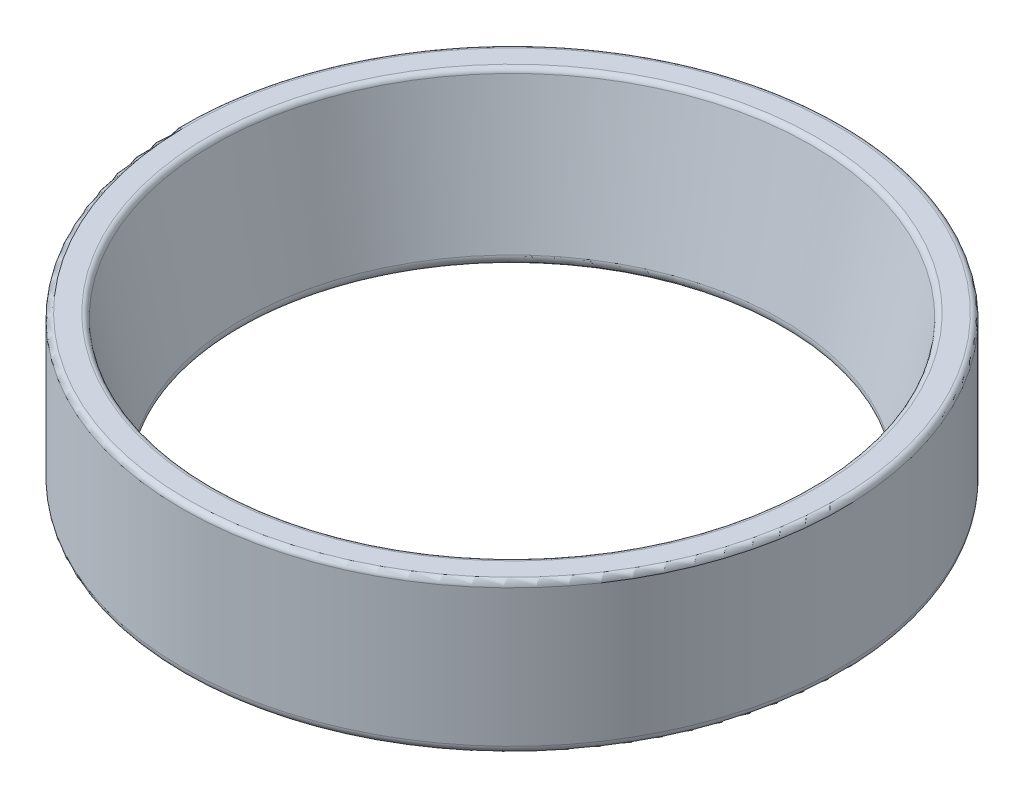
ISO-10303-21;
HEADER;
FILE_DESCRIPTION(('STEP AP214'),'2;1');
FILE_NAME('part.step','',(''),(''),'','','');
FILE_SCHEMA(('AUTOMOTIVE_DESIGN { 1 0 10303 214 1 1 1 1 }'));
ENDSEC;
DATA;
#1=APPLICATION_CONTEXT('core data for automotive mechanical design processes');
#2=APPLICATION_PROTOCOL_DEFINITION('international standard','automotive_design',2000,#1);
#3=PRODUCT_CONTEXT('',#1,'mechanical');
#4=PRODUCT('Part','Part','',(#3));
#5=PRODUCT_RELATED_PRODUCT_CATEGORY('part','',(#4));
#6=PRODUCT_DEFINITION_FORMATION('','',#4);
#7=PRODUCT_DEFINITION_CONTEXT('part definition',#1,'design');
#8=PRODUCT_DEFINITION('design','',#6,#7);
#9=PRODUCT_DEFINITION_SHAPE('','',#8);
#10=(LENGTH_UNIT() NAMED_UNIT(*) SI_UNIT(.MILLI.,.METRE.));
#11=(NAMED_UNIT(*) PLANE_ANGLE_UNIT() SI_UNIT($,.RADIAN.));
#12=(NAMED_UNIT(*) SI_UNIT($,.STERADIAN.) SOLID_ANGLE_UNIT());
#13=UNCERTAINTY_MEASURE_WITH_UNIT(LENGTH_MEASURE(1.E-05),#10,'distance_accuracy_value','');
#14=(GEOMETRIC_REPRESENTATION_CONTEXT(3) GLOBAL_UNCERTAINTY_ASSIGNED_CONTEXT((#13)) GLOBAL_UNIT_ASSIGNED_CONTEXT((#10,
#11,#12)) REPRESENTATION_CONTEXT('',''));
#15=CARTESIAN_POINT('',(0.,0.,0.));
#16=DIRECTION('',(0.,0.,1.));
#17=DIRECTION('',(1.,0.,0.));
#18=AXIS2_PLACEMENT_3D('',#15,#16,#17);
#19=CARTESIAN_POINT('',(0.,0.8,0.));
#20=DIRECTION('',(0.,1.,0.));
#21=DIRECTION('',(0.,0.,1.));
#22=AXIS2_PLACEMENT_3D('',#19,#20,#21);
#23=TOROIDAL_SURFACE('',#22,29.7,0.800000000000001);
#24=CARTESIAN_POINT('',(0.,0.,0.));
#25=DIRECTION('',(0.,1.,0.));
#26=DIRECTION('',(0.,0.,1.));
#27=AXIS2_PLACEMENT_3D('',#24,#25,#26);
#28=CIRCLE('',#27,29.7);
#29=CARTESIAN_POINT('',(0.,0.,29.7));
#30=VERTEX_POINT('',#29);
#31=EDGE_CURVE('E59',#30,#30,#28,.T.);
#32=ORIENTED_EDGE('',*,*,#31,.T.);
#33=EDGE_LOOP('',(#32));
#34=FACE_BOUND('',#33,.T.);
#35=CARTESIAN_POINT('',(0.,0.800000000000006,0.));
#36=DIRECTION('',(0.,1.,0.));
#37=DIRECTION('',(0.,0.,1.));
#38=AXIS2_PLACEMENT_3D('',#35,#36,#37);
#39=CIRCLE('',#38,30.5);
#40=CARTESIAN_POINT('',(0.,0.800000000000006,30.5));
#41=VERTEX_POINT('',#40);
#42=EDGE_CURVE('E10',#41,#41,#39,.T.);
#43=ORIENTED_EDGE('',*,*,#42,.F.);
#44=EDGE_LOOP('',(#43));
#45=FACE_BOUND('',#44,.T.);
#46=ADVANCED_FACE('F31',(#34,#45),#23,.T.);
#47=CARTESIAN_POINT('',(0.,17.6908957415565,0.));
#48=DIRECTION('',(0.,1.,0.));
#49=DIRECTION('',(0.,0.,1.));
#50=AXIS2_PLACEMENT_3D('',#47,#48,#49);
#51=CYLINDRICAL_SURFACE('',#50,30.5);
#52=ORIENTED_EDGE('',*,*,#42,.T.);
#53=EDGE_LOOP('',(#52));
#54=FACE_BOUND('',#53,.T.);
#55=CARTESIAN_POINT('',(0.,13.5,0.));
#56=DIRECTION('',(0.,1.,0.));
#57=DIRECTION('',(0.,0.,1.));
#58=AXIS2_PLACEMENT_3D('',#55,#56,#57);
#59=CIRCLE('',#58,30.5);
#60=CARTESIAN_POINT('',(0.,13.5,30.5));
#61=VERTEX_POINT('',#60);
#62=EDGE_CURVE('E37',#61,#61,#59,.T.);
#63=ORIENTED_EDGE('',*,*,#62,.F.);
#64=EDGE_LOOP('',(#63));
#65=FACE_BOUND('',#64,.T.);
#66=ADVANCED_FACE('F77',(#54,#65),#51,.T.);
#67=CARTESIAN_POINT('',(0.,13.5,0.));
#68=DIRECTION('',(0.,1.,0.));
#69=DIRECTION('',(0.,0.,1.));
#70=AXIS2_PLACEMENT_3D('',#67,#68,#69);
#71=TOROIDAL_SURFACE('',#70,30.,0.5);
#72=ORIENTED_EDGE('',*,*,#62,.T.);
#73=EDGE_LOOP('',(#72));
#74=FACE_BOUND('',#73,.T.);
#75=CARTESIAN_POINT('',(0.,14.,0.));
#76=DIRECTION('',(0.,1.,0.));
#77=DIRECTION('',(0.,0.,1.));
#78=AXIS2_PLACEMENT_3D('',#75,#76,#77);
#79=CIRCLE('',#78,30.);
#80=CARTESIAN_POINT('',(0.,14.,30.));
#81=VERTEX_POINT('',#80);
#82=EDGE_CURVE('E41',#81,#81,#79,.T.);
#83=ORIENTED_EDGE('',*,*,#82,.F.);
#84=EDGE_LOOP('',(#83));
#85=FACE_BOUND('',#84,.T.);
#86=ADVANCED_FACE('F81',(#74,#85),#71,.T.);
#87=CARTESIAN_POINT('',(-28.154207895117,14.,0.));
#88=DIRECTION('',(0.,1.,0.));
#89=DIRECTION('',(0.,0.,1.));
#90=AXIS2_PLACEMENT_3D('',#87,#88,#89);
#91=PLANE('',#90);
#92=ORIENTED_EDGE('',*,*,#82,.T.);
#93=EDGE_LOOP('',(#92));
#94=FACE_BOUND('',#93,.T.);
#95=CARTESIAN_POINT('',(0.,14.,0.));
#96=DIRECTION('',(0.,1.,0.));
#97=DIRECTION('',(0.,0.,1.));
#98=AXIS2_PLACEMENT_3D('',#95,#96,#97);
#99=CIRCLE('',#98,28.154207895117);
#100=CARTESIAN_POINT('',(0.,14.,28.154207895117));
#101=VERTEX_POINT('',#100);
#102=EDGE_CURVE('E45',#101,#101,#99,.T.);
#103=ORIENTED_EDGE('',*,*,#102,.F.);
#104=EDGE_LOOP('',(#103));
#105=FACE_BOUND('',#104,.T.);
#106=ADVANCED_FACE('F85',(#94,#105),#91,.T.);
#107=CARTESIAN_POINT('',(0.,13.5,0.));
#108=DIRECTION('',(0.,1.,0.));
#109=DIRECTION('',(0.,0.,1.));
#110=AXIS2_PLACEMENT_3D('',#107,#108,#109);
#111=TOROIDAL_SURFACE('',#110,28.154207895117,0.5);
#112=ORIENTED_EDGE('',*,*,#102,.T.);
#113=EDGE_LOOP('',(#112));
#114=FACE_BOUND('',#113,.T.);
#115=CARTESIAN_POINT('',(0.,13.6047645443654,0.));
#116=DIRECTION('',(0.,1.,0.));
#117=DIRECTION('',(0.,0.,1.));
#118=AXIS2_PLACEMENT_3D('',#115,#116,#117);
#119=CIRCLE('',#118,27.6653066880783);
#120=CARTESIAN_POINT('',(0.,13.6047645443654,27.6653066880783));
#121=VERTEX_POINT('',#120);
#122=EDGE_CURVE('E50',#121,#121,#119,.T.);
#123=ORIENTED_EDGE('',*,*,#122,.F.);
#124=EDGE_LOOP('',(#123));
#125=FACE_BOUND('',#124,.T.);
#126=ADVANCED_FACE('F91',(#114,#125),#111,.T.);
#127=CARTESIAN_POINT('',(0.,0.967623270984704,0.));
#128=DIRECTION('',(0.,1.,0.));
#129=DIRECTION('',(0.,0.,1.));
#130=AXIS2_PLACEMENT_3D('',#127,#128,#129);
#131=CONICAL_SURFACE('',#130,24.9573478437824,0.211093333222747);
#132=ORIENTED_EDGE('',*,*,#122,.T.);
#133=EDGE_LOOP('',(#132));
#134=FACE_BOUND('',#133,.T.);
#135=CARTESIAN_POINT('',(0.,0.967623270984704,0.));
#136=DIRECTION('',(0.,1.,0.));
#137=DIRECTION('',(0.,0.,1.));
#138=AXIS2_PLACEMENT_3D('',#135,#136,#137);
#139=CIRCLE('',#138,24.9573478437824);
#140=CARTESIAN_POINT('',(0.,0.967623270984704,24.9573478437824));
#141=VERTEX_POINT('',#140);
#142=EDGE_CURVE('E53',#141,#141,#139,.T.);
#143=ORIENTED_EDGE('',*,*,#142,.F.);
#144=EDGE_LOOP('',(#143));
#145=FACE_BOUND('',#144,.T.);
#146=ADVANCED_FACE('F73',(#134,#145),#131,.F.);
#147=CARTESIAN_POINT('',(0.,0.799999999999998,0.));
#148=DIRECTION('',(0.,1.,0.));
#149=DIRECTION('',(0.,0.,1.));
#150=AXIS2_PLACEMENT_3D('',#147,#148,#149);
#151=TOROIDAL_SURFACE('',#150,25.7395897750444,0.800000000000001);
#152=ORIENTED_EDGE('',*,*,#142,.T.);
#153=EDGE_LOOP('',(#152));
#154=FACE_BOUND('',#153,.T.);
#155=CARTESIAN_POINT('',(0.,0.,0.));
#156=DIRECTION('',(0.,1.,0.));
#157=DIRECTION('',(0.,0.,1.));
#158=AXIS2_PLACEMENT_3D('',#155,#156,#157);
#159=CIRCLE('',#158,25.7395897750444);
#160=CARTESIAN_POINT('',(0.,0.,25.7395897750444));
#161=VERTEX_POINT('',#160);
#162=EDGE_CURVE('E56',#161,#161,#159,.T.);
#163=ORIENTED_EDGE('',*,*,#162,.F.);
#164=EDGE_LOOP('',(#163));
#165=FACE_BOUND('',#164,.T.);
#166=ADVANCED_FACE('F67',(#154,#165),#151,.T.);
#167=CARTESIAN_POINT('',(-29.7,0.,0.));
#168=DIRECTION('',(0.,-1.,0.));
#169=DIRECTION('',(0.,0.,-1.));
#170=AXIS2_PLACEMENT_3D('',#167,#168,#169);
#171=PLANE('',#170);
#172=ORIENTED_EDGE('',*,*,#162,.T.);
#173=EDGE_LOOP('',(#172));
#174=FACE_BOUND('',#173,.T.);
#175=ORIENTED_EDGE('',*,*,#31,.F.);
#176=EDGE_LOOP('',(#175));
#177=FACE_BOUND('',#176,.T.);
#178=ADVANCED_FACE('F65',(#174,#177),#171,.T.);
#179=CLOSED_SHELL('',(#46,#66,#86,#106,#126,#146,#166,#178));
#180=MANIFOLD_SOLID_BREP('B2',#179);
#181=ADVANCED_BREP_SHAPE_REPRESENTATION('',(#18,#180),#14);
#182=SHAPE_DEFINITION_REPRESENTATION(#9,#181);
ENDSEC;
END-ISO-10303-21;
